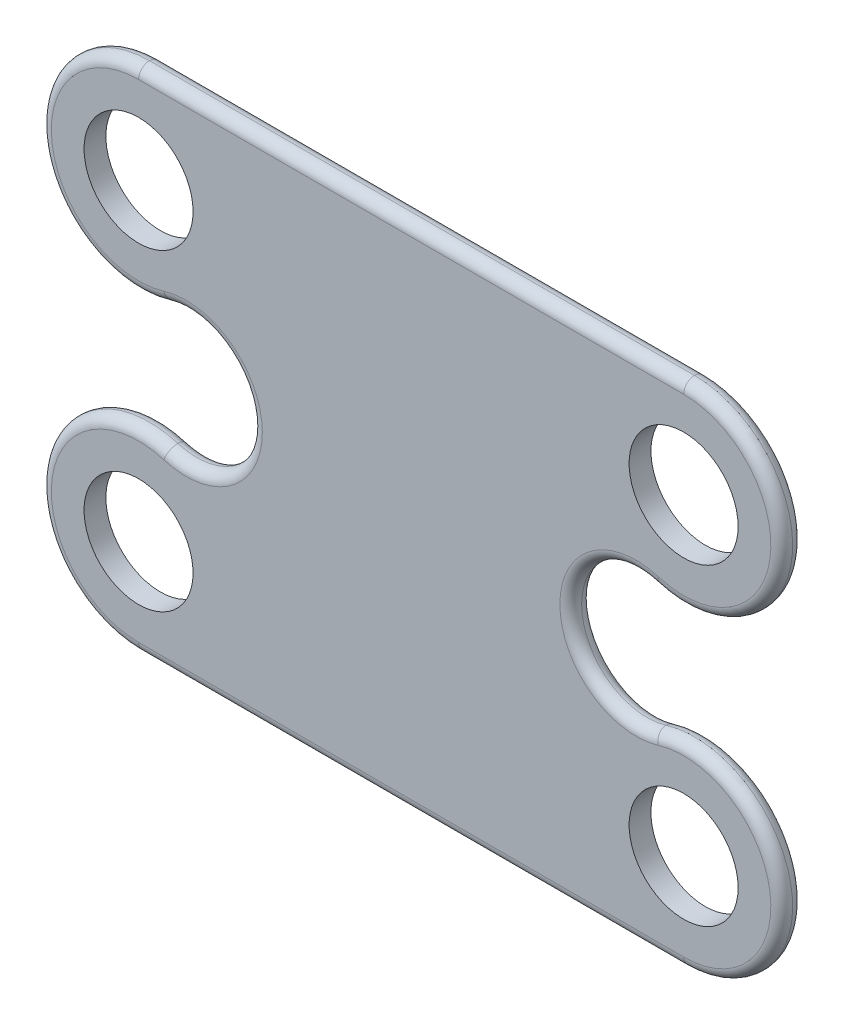
ISO-10303-21;
HEADER;
FILE_DESCRIPTION(('STEP AP214'),'2;1');
FILE_NAME('part.step','',(''),(''),'','','');
FILE_SCHEMA(('AUTOMOTIVE_DESIGN { 1 0 10303 214 1 1 1 1 }'));
ENDSEC;
DATA;
#1=APPLICATION_CONTEXT('core data for automotive mechanical design processes');
#2=APPLICATION_PROTOCOL_DEFINITION('international standard','automotive_design',2000,#1);
#3=PRODUCT_CONTEXT('',#1,'mechanical');
#4=PRODUCT('Part','Part','',(#3));
#5=PRODUCT_RELATED_PRODUCT_CATEGORY('part','',(#4));
#6=PRODUCT_DEFINITION_FORMATION('','',#4);
#7=PRODUCT_DEFINITION_CONTEXT('part definition',#1,'design');
#8=PRODUCT_DEFINITION('design','',#6,#7);
#9=PRODUCT_DEFINITION_SHAPE('','',#8);
#10=(LENGTH_UNIT() NAMED_UNIT(*) SI_UNIT(.MILLI.,.METRE.));
#11=(NAMED_UNIT(*) PLANE_ANGLE_UNIT() SI_UNIT($,.RADIAN.));
#12=(NAMED_UNIT(*) SI_UNIT($,.STERADIAN.) SOLID_ANGLE_UNIT());
#13=UNCERTAINTY_MEASURE_WITH_UNIT(LENGTH_MEASURE(1.E-05),#10,'distance_accuracy_value','');
#14=(GEOMETRIC_REPRESENTATION_CONTEXT(3) GLOBAL_UNCERTAINTY_ASSIGNED_CONTEXT((#13)) GLOBAL_UNIT_ASSIGNED_CONTEXT((#10,
#11,#12)) REPRESENTATION_CONTEXT('',''));
#15=CARTESIAN_POINT('',(0.,0.,0.));
#16=DIRECTION('',(0.,0.,1.));
#17=DIRECTION('',(1.,0.,0.));
#18=AXIS2_PLACEMENT_3D('',#15,#16,#17);
#19=CARTESIAN_POINT('',(-25.,-14.3541525327841,2.));
#20=DIRECTION('',(0.,0.,-1.));
#21=DIRECTION('',(-1.,0.,0.));
#22=AXIS2_PLACEMENT_3D('',#19,#20,#21);
#23=CYLINDRICAL_SURFACE('',#22,5.);
#24=CARTESIAN_POINT('',(-25.,-14.3541525327841,2.));
#25=DIRECTION('',(0.,0.,1.));
#26=DIRECTION('',(1.,0.,0.));
#27=AXIS2_PLACEMENT_3D('',#24,#25,#26);
#28=CIRCLE('',#27,5.);
#29=CARTESIAN_POINT('',(-20.,-14.3541525327841,2.));
#30=VERTEX_POINT('',#29);
#31=EDGE_CURVE('E224',#30,#30,#28,.T.);
#32=ORIENTED_EDGE('',*,*,#31,.T.);
#33=EDGE_LOOP('',(#32));
#34=FACE_BOUND('',#33,.T.);
#35=CARTESIAN_POINT('',(-25.,-14.3541525327841,0.));
#36=DIRECTION('',(0.,0.,1.));
#37=DIRECTION('',(1.,0.,0.));
#38=AXIS2_PLACEMENT_3D('',#35,#36,#37);
#39=CIRCLE('',#38,5.);
#40=CARTESIAN_POINT('',(-20.,-14.3541525327841,0.));
#41=VERTEX_POINT('',#40);
#42=EDGE_CURVE('E229',#41,#41,#39,.T.);
#43=ORIENTED_EDGE('',*,*,#42,.F.);
#44=EDGE_LOOP('',(#43));
#45=FACE_BOUND('',#44,.T.);
#46=ADVANCED_FACE('F36',(#34,#45),#23,.F.);
#47=CARTESIAN_POINT('',(-25.,14.3541525327841,2.));
#48=DIRECTION('',(0.,0.,-1.));
#49=DIRECTION('',(-1.,0.,0.));
#50=AXIS2_PLACEMENT_3D('',#47,#48,#49);
#51=CYLINDRICAL_SURFACE('',#50,5.);
#52=CARTESIAN_POINT('',(-25.,14.3541525327841,2.));
#53=DIRECTION('',(0.,0.,1.));
#54=DIRECTION('',(1.,0.,0.));
#55=AXIS2_PLACEMENT_3D('',#52,#53,#54);
#56=CIRCLE('',#55,5.);
#57=CARTESIAN_POINT('',(-20.,14.3541525327841,2.));
#58=VERTEX_POINT('',#57);
#59=EDGE_CURVE('E496',#58,#58,#56,.F.);
#60=ORIENTED_EDGE('',*,*,#59,.F.);
#61=EDGE_LOOP('',(#60));
#62=FACE_BOUND('',#61,.T.);
#63=CARTESIAN_POINT('',(-25.,14.3541525327841,0.));
#64=DIRECTION('',(0.,0.,1.));
#65=DIRECTION('',(1.,0.,0.));
#66=AXIS2_PLACEMENT_3D('',#63,#64,#65);
#67=CIRCLE('',#66,5.);
#68=CARTESIAN_POINT('',(-20.,14.3541525327841,0.));
#69=VERTEX_POINT('',#68);
#70=EDGE_CURVE('E221',#69,#69,#67,.F.);
#71=ORIENTED_EDGE('',*,*,#70,.T.);
#72=EDGE_LOOP('',(#71));
#73=FACE_BOUND('',#72,.T.);
#74=ADVANCED_FACE('F300',(#62,#73),#51,.F.);
#75=CARTESIAN_POINT('',(25.,14.3541525327841,2.));
#76=DIRECTION('',(0.,0.,-1.));
#77=DIRECTION('',(-1.,0.,0.));
#78=AXIS2_PLACEMENT_3D('',#75,#76,#77);
#79=CYLINDRICAL_SURFACE('',#78,5.);
#80=CARTESIAN_POINT('',(25.,14.3541525327841,2.));
#81=DIRECTION('',(0.,0.,1.));
#82=DIRECTION('',(1.,0.,0.));
#83=AXIS2_PLACEMENT_3D('',#80,#81,#82);
#84=CIRCLE('',#83,5.);
#85=CARTESIAN_POINT('',(30.,14.3541525327841,2.));
#86=VERTEX_POINT('',#85);
#87=EDGE_CURVE('E492',#86,#86,#84,.T.);
#88=ORIENTED_EDGE('',*,*,#87,.T.);
#89=EDGE_LOOP('',(#88));
#90=FACE_BOUND('',#89,.T.);
#91=CARTESIAN_POINT('',(25.,14.3541525327841,0.));
#92=DIRECTION('',(0.,0.,1.));
#93=DIRECTION('',(1.,0.,0.));
#94=AXIS2_PLACEMENT_3D('',#91,#92,#93);
#95=CIRCLE('',#94,5.);
#96=CARTESIAN_POINT('',(30.,14.3541525327841,0.));
#97=VERTEX_POINT('',#96);
#98=EDGE_CURVE('E216',#97,#97,#95,.T.);
#99=ORIENTED_EDGE('',*,*,#98,.F.);
#100=EDGE_LOOP('',(#99));
#101=FACE_BOUND('',#100,.T.);
#102=ADVANCED_FACE('F306',(#90,#101),#79,.F.);
#103=CARTESIAN_POINT('',(25.,-14.3541525327841,2.));
#104=DIRECTION('',(0.,0.,-1.));
#105=DIRECTION('',(-1.,0.,0.));
#106=AXIS2_PLACEMENT_3D('',#103,#104,#105);
#107=CYLINDRICAL_SURFACE('',#106,5.);
#108=CARTESIAN_POINT('',(25.,-14.3541525327841,2.));
#109=DIRECTION('',(0.,0.,1.));
#110=DIRECTION('',(1.,0.,0.));
#111=AXIS2_PLACEMENT_3D('',#108,#109,#110);
#112=CIRCLE('',#111,5.);
#113=CARTESIAN_POINT('',(30.,-14.3541525327841,2.));
#114=VERTEX_POINT('',#113);
#115=EDGE_CURVE('E232',#114,#114,#112,.F.);
#116=ORIENTED_EDGE('',*,*,#115,.F.);
#117=EDGE_LOOP('',(#116));
#118=FACE_BOUND('',#117,.T.);
#119=CARTESIAN_POINT('',(25.,-14.3541525327841,0.));
#120=DIRECTION('',(0.,0.,1.));
#121=DIRECTION('',(1.,0.,0.));
#122=AXIS2_PLACEMENT_3D('',#119,#120,#121);
#123=CIRCLE('',#122,5.);
#124=CARTESIAN_POINT('',(30.,-14.3541525327841,0.));
#125=VERTEX_POINT('',#124);
#126=EDGE_CURVE('E214',#125,#125,#123,.F.);
#127=ORIENTED_EDGE('',*,*,#126,.T.);
#128=EDGE_LOOP('',(#127));
#129=FACE_BOUND('',#128,.T.);
#130=ADVANCED_FACE('F316',(#118,#129),#107,.F.);
#131=CARTESIAN_POINT('',(0.,0.,2.));
#132=DIRECTION('',(0.,0.,1.));
#133=DIRECTION('',(1.,0.,0.));
#134=AXIS2_PLACEMENT_3D('',#131,#132,#133);
#135=PLANE('',#134);
#136=CARTESIAN_POINT('',(-25.,-14.3541525327841,2.));
#137=DIRECTION('',(0.,0.,1.));
#138=DIRECTION('',(1.,0.,0.));
#139=AXIS2_PLACEMENT_3D('',#136,#137,#138);
#140=CIRCLE('',#139,7.99999999999999);
#141=CARTESIAN_POINT('',(-22.6778060907875,-6.69860451529925,2.));
#142=VERTEX_POINT('',#141);
#143=CARTESIAN_POINT('',(-25.,-22.3541525327841,2.));
#144=VERTEX_POINT('',#143);
#145=EDGE_CURVE('E235',#142,#144,#140,.T.);
#146=ORIENTED_EDGE('',*,*,#145,.T.);
#147=DIRECTION('',(-1.,0.,0.));
#148=VECTOR('',#147,1.);
#149=CARTESIAN_POINT('',(0.,-22.3541525327841,2.));
#150=LINE('',#149,#148);
#151=CARTESIAN_POINT('',(25.,-22.3541525327841,2.));
#152=VERTEX_POINT('',#151);
#153=EDGE_CURVE('E246',#144,#152,#150,.F.);
#154=ORIENTED_EDGE('',*,*,#153,.T.);
#155=CARTESIAN_POINT('',(25.,-14.3541525327841,2.));
#156=DIRECTION('',(0.,0.,1.));
#157=DIRECTION('',(1.,0.,0.));
#158=AXIS2_PLACEMENT_3D('',#155,#156,#157);
#159=CIRCLE('',#158,8.);
#160=CARTESIAN_POINT('',(22.6778060907875,-6.69860451529924,2.));
#161=VERTEX_POINT('',#160);
#162=EDGE_CURVE('E244',#152,#161,#159,.T.);
#163=ORIENTED_EDGE('',*,*,#162,.T.);
#164=CARTESIAN_POINT('',(20.6458864202265,0.,2.));
#165=DIRECTION('',(0.,0.,1.));
#166=DIRECTION('',(1.,0.,0.));
#167=AXIS2_PLACEMENT_3D('',#164,#165,#166);
#168=CIRCLE('',#167,7.);
#169=CARTESIAN_POINT('',(22.6778060907875,6.69860451529925,2.));
#170=VERTEX_POINT('',#169);
#171=EDGE_CURVE('E242',#161,#170,#168,.F.);
#172=ORIENTED_EDGE('',*,*,#171,.T.);
#173=CARTESIAN_POINT('',(25.,14.3541525327841,2.));
#174=DIRECTION('',(0.,0.,1.));
#175=DIRECTION('',(1.,0.,0.));
#176=AXIS2_PLACEMENT_3D('',#173,#174,#175);
#177=CIRCLE('',#176,8.);
#178=CARTESIAN_POINT('',(25.,22.3541525327841,2.));
#179=VERTEX_POINT('',#178);
#180=EDGE_CURVE('E240',#170,#179,#177,.T.);
#181=ORIENTED_EDGE('',*,*,#180,.T.);
#182=DIRECTION('',(-1.,0.,0.));
#183=VECTOR('',#182,1.);
#184=CARTESIAN_POINT('',(-25.,22.3541525327841,2.));
#185=LINE('',#184,#183);
#186=CARTESIAN_POINT('',(-25.,22.3541525327841,2.));
#187=VERTEX_POINT('',#186);
#188=EDGE_CURVE('E238',#179,#187,#185,.T.);
#189=ORIENTED_EDGE('',*,*,#188,.T.);
#190=CARTESIAN_POINT('',(-25.,14.3541525327841,2.));
#191=DIRECTION('',(0.,0.,1.));
#192=DIRECTION('',(1.,0.,0.));
#193=AXIS2_PLACEMENT_3D('',#190,#191,#192);
#194=CIRCLE('',#193,7.99999999999999);
#195=CARTESIAN_POINT('',(-22.6778060907875,6.69860451529924,2.));
#196=VERTEX_POINT('',#195);
#197=EDGE_CURVE('E96',#187,#196,#194,.T.);
#198=ORIENTED_EDGE('',*,*,#197,.T.);
#199=CARTESIAN_POINT('',(-20.6458864202265,0.,2.));
#200=DIRECTION('',(0.,0.,1.));
#201=DIRECTION('',(1.,0.,0.));
#202=AXIS2_PLACEMENT_3D('',#199,#200,#201);
#203=CIRCLE('',#202,7.);
#204=EDGE_CURVE('E233',#196,#142,#203,.F.);
#205=ORIENTED_EDGE('',*,*,#204,.T.);
#206=EDGE_LOOP('',(#146,#154,#163,#172,#181,#189,#198,#205));
#207=FACE_BOUND('',#206,.T.);
#208=ORIENTED_EDGE('',*,*,#115,.T.);
#209=EDGE_LOOP('',(#208));
#210=FACE_BOUND('',#209,.T.);
#211=ORIENTED_EDGE('',*,*,#87,.F.);
#212=EDGE_LOOP('',(#211));
#213=FACE_BOUND('',#212,.T.);
#214=ORIENTED_EDGE('',*,*,#59,.T.);
#215=EDGE_LOOP('',(#214));
#216=FACE_BOUND('',#215,.T.);
#217=ORIENTED_EDGE('',*,*,#31,.F.);
#218=EDGE_LOOP('',(#217));
#219=FACE_BOUND('',#218,.T.);
#220=ADVANCED_FACE('F320',(#207,#210,#213,#216,#219),#135,.T.);
#221=CARTESIAN_POINT('',(0.,0.,0.));
#222=DIRECTION('',(0.,0.,1.));
#223=DIRECTION('',(1.,0.,0.));
#224=AXIS2_PLACEMENT_3D('',#221,#222,#223);
#225=PLANE('',#224);
#226=CARTESIAN_POINT('',(25.,-14.3541525327841,0.));
#227=DIRECTION('',(0.,0.,1.));
#228=DIRECTION('',(1.,0.,0.));
#229=AXIS2_PLACEMENT_3D('',#226,#227,#228);
#230=CIRCLE('',#229,8.);
#231=CARTESIAN_POINT('',(22.6778060907875,-6.69860451529924,0.));
#232=VERTEX_POINT('',#231);
#233=CARTESIAN_POINT('',(25.,-22.3541525327841,0.));
#234=VERTEX_POINT('',#233);
#235=EDGE_CURVE('E46',#232,#234,#230,.F.);
#236=ORIENTED_EDGE('',*,*,#235,.T.);
#237=DIRECTION('',(-1.,0.,0.));
#238=VECTOR('',#237,1.);
#239=CARTESIAN_POINT('',(-25.,-22.3541525327841,0.));
#240=LINE('',#239,#238);
#241=CARTESIAN_POINT('',(-25.,-22.3541525327841,0.));
#242=VERTEX_POINT('',#241);
#243=EDGE_CURVE('E11',#234,#242,#240,.T.);
#244=ORIENTED_EDGE('',*,*,#243,.T.);
#245=CARTESIAN_POINT('',(-25.,-14.3541525327841,0.));
#246=DIRECTION('',(0.,0.,1.));
#247=DIRECTION('',(1.,0.,0.));
#248=AXIS2_PLACEMENT_3D('',#245,#246,#247);
#249=CIRCLE('',#248,7.99999999999999);
#250=CARTESIAN_POINT('',(-22.6778060907875,-6.69860451529925,0.));
#251=VERTEX_POINT('',#250);
#252=EDGE_CURVE('E251',#242,#251,#249,.F.);
#253=ORIENTED_EDGE('',*,*,#252,.T.);
#254=CARTESIAN_POINT('',(-20.6458864202265,0.,0.));
#255=DIRECTION('',(0.,0.,1.));
#256=DIRECTION('',(1.,0.,0.));
#257=AXIS2_PLACEMENT_3D('',#254,#255,#256);
#258=CIRCLE('',#257,7.);
#259=CARTESIAN_POINT('',(-22.6778060907875,6.69860451529924,0.));
#260=VERTEX_POINT('',#259);
#261=EDGE_CURVE('E249',#251,#260,#258,.T.);
#262=ORIENTED_EDGE('',*,*,#261,.T.);
#263=CARTESIAN_POINT('',(-25.,14.3541525327841,0.));
#264=DIRECTION('',(0.,0.,1.));
#265=DIRECTION('',(1.,0.,0.));
#266=AXIS2_PLACEMENT_3D('',#263,#264,#265);
#267=CIRCLE('',#266,7.99999999999999);
#268=CARTESIAN_POINT('',(-25.,22.3541525327841,0.));
#269=VERTEX_POINT('',#268);
#270=EDGE_CURVE('E253',#260,#269,#267,.F.);
#271=ORIENTED_EDGE('',*,*,#270,.T.);
#272=DIRECTION('',(-1.,0.,0.));
#273=VECTOR('',#272,1.);
#274=CARTESIAN_POINT('',(0.,22.3541525327841,0.));
#275=LINE('',#274,#273);
#276=CARTESIAN_POINT('',(25.,22.3541525327841,0.));
#277=VERTEX_POINT('',#276);
#278=EDGE_CURVE('E139',#269,#277,#275,.F.);
#279=ORIENTED_EDGE('',*,*,#278,.T.);
#280=CARTESIAN_POINT('',(25.,14.3541525327841,0.));
#281=DIRECTION('',(0.,0.,1.));
#282=DIRECTION('',(1.,0.,0.));
#283=AXIS2_PLACEMENT_3D('',#280,#281,#282);
#284=CIRCLE('',#283,8.);
#285=CARTESIAN_POINT('',(22.6778060907875,6.69860451529925,0.));
#286=VERTEX_POINT('',#285);
#287=EDGE_CURVE('E132',#277,#286,#284,.F.);
#288=ORIENTED_EDGE('',*,*,#287,.T.);
#289=CARTESIAN_POINT('',(20.6458864202265,0.,0.));
#290=DIRECTION('',(0.,0.,1.));
#291=DIRECTION('',(1.,0.,0.));
#292=AXIS2_PLACEMENT_3D('',#289,#290,#291);
#293=CIRCLE('',#292,7.);
#294=EDGE_CURVE('E137',#286,#232,#293,.T.);
#295=ORIENTED_EDGE('',*,*,#294,.T.);
#296=EDGE_LOOP('',(#236,#244,#253,#262,#271,#279,#288,#295));
#297=FACE_BOUND('',#296,.T.);
#298=ORIENTED_EDGE('',*,*,#126,.F.);
#299=EDGE_LOOP('',(#298));
#300=FACE_BOUND('',#299,.T.);
#301=ORIENTED_EDGE('',*,*,#98,.T.);
#302=EDGE_LOOP('',(#301));
#303=FACE_BOUND('',#302,.T.);
#304=ORIENTED_EDGE('',*,*,#70,.F.);
#305=EDGE_LOOP('',(#304));
#306=FACE_BOUND('',#305,.T.);
#307=ORIENTED_EDGE('',*,*,#42,.T.);
#308=EDGE_LOOP('',(#307));
#309=FACE_BOUND('',#308,.T.);
#310=ADVANCED_FACE('F134',(#297,#300,#303,#306,#309),#225,.F.);
#311=CARTESIAN_POINT('',(0.,22.3541525327841,1.));
#312=DIRECTION('',(-1.,0.,0.));
#313=DIRECTION('',(0.,-1.,0.));
#314=AXIS2_PLACEMENT_3D('',#311,#312,#313);
#315=CYLINDRICAL_SURFACE('',#314,1.);
#316=CARTESIAN_POINT('',(25.,22.3541525327841,1.));
#317=DIRECTION('',(1.,0.,0.));
#318=DIRECTION('',(0.,0.,-1.));
#319=AXIS2_PLACEMENT_3D('',#316,#317,#318);
#320=CIRCLE('',#319,1.);
#321=CARTESIAN_POINT('',(25.,23.3541525327841,1.));
#322=VERTEX_POINT('',#321);
#323=EDGE_CURVE('E40',#277,#322,#320,.T.);
#324=ORIENTED_EDGE('',*,*,#323,.F.);
#325=ORIENTED_EDGE('',*,*,#278,.F.);
#326=CARTESIAN_POINT('',(-25.,22.3541525327841,1.));
#327=DIRECTION('',(-1.,0.,0.));
#328=DIRECTION('',(0.,0.,1.));
#329=AXIS2_PLACEMENT_3D('',#326,#327,#328);
#330=CIRCLE('',#329,1.);
#331=CARTESIAN_POINT('',(-25.,23.3541525327841,1.));
#332=VERTEX_POINT('',#331);
#333=EDGE_CURVE('E82',#332,#269,#330,.T.);
#334=ORIENTED_EDGE('',*,*,#333,.F.);
#335=DIRECTION('',(-1.,0.,0.));
#336=VECTOR('',#335,1.);
#337=CARTESIAN_POINT('',(0.,23.3541525327841,1.));
#338=LINE('',#337,#336);
#339=EDGE_CURVE('E210',#322,#332,#338,.T.);
#340=ORIENTED_EDGE('',*,*,#339,.F.);
#341=EDGE_LOOP('',(#324,#325,#334,#340));
#342=FACE_BOUND('',#341,.T.);
#343=ADVANCED_FACE('F38',(#342),#315,.T.);
#344=CARTESIAN_POINT('',(25.,14.3541525327841,1.));
#345=DIRECTION('',(0.,0.,1.));
#346=DIRECTION('',(1.,0.,0.));
#347=AXIS2_PLACEMENT_3D('',#344,#345,#346);
#348=TOROIDAL_SURFACE('',#347,8.,1.);
#349=ORIENTED_EDGE('',*,*,#287,.F.);
#350=ORIENTED_EDGE('',*,*,#323,.T.);
#351=CARTESIAN_POINT('',(25.,14.3541525327841,1.));
#352=DIRECTION('',(0.,0.,1.));
#353=DIRECTION('',(1.,0.,0.));
#354=AXIS2_PLACEMENT_3D('',#351,#352,#353);
#355=CIRCLE('',#354,9.);
#356=CARTESIAN_POINT('',(22.3875318521359,5.74166101311364,1.));
#357=VERTEX_POINT('',#356);
#358=EDGE_CURVE('E145',#357,#322,#355,.T.);
#359=ORIENTED_EDGE('',*,*,#358,.F.);
#360=CARTESIAN_POINT('',(22.6778060907875,6.69860451529925,1.));
#361=DIRECTION('',(-0.956943502185606,0.290274238651567,0.));
#362=DIRECTION('',(-0.290274238651567,-0.956943502185606,0.));
#363=AXIS2_PLACEMENT_3D('',#360,#361,#362);
#364=CIRCLE('',#363,1.);
#365=EDGE_CURVE('E142',#286,#357,#364,.T.);
#366=ORIENTED_EDGE('',*,*,#365,.F.);
#367=EDGE_LOOP('',(#349,#350,#359,#366));
#368=FACE_BOUND('',#367,.T.);
#369=ADVANCED_FACE('F143',(#368),#348,.T.);
#370=CARTESIAN_POINT('',(-25.,14.3541525327841,1.));
#371=DIRECTION('',(0.,0.,1.));
#372=DIRECTION('',(1.,0.,0.));
#373=AXIS2_PLACEMENT_3D('',#370,#371,#372);
#374=TOROIDAL_SURFACE('',#373,7.99999999999999,1.);
#375=ORIENTED_EDGE('',*,*,#333,.T.);
#376=ORIENTED_EDGE('',*,*,#270,.F.);
#377=CARTESIAN_POINT('',(-22.6778060907875,6.69860451529925,1.));
#378=DIRECTION('',(0.956943502185606,0.290274238651567,0.));
#379=DIRECTION('',(-0.290274238651567,0.956943502185606,0.));
#380=AXIS2_PLACEMENT_3D('',#377,#378,#379);
#381=CIRCLE('',#380,1.);
#382=CARTESIAN_POINT('',(-22.3875318521359,5.74166101311364,1.));
#383=VERTEX_POINT('',#382);
#384=EDGE_CURVE('E148',#383,#260,#381,.T.);
#385=ORIENTED_EDGE('',*,*,#384,.F.);
#386=CARTESIAN_POINT('',(-25.,14.3541525327841,1.));
#387=DIRECTION('',(0.,0.,1.));
#388=DIRECTION('',(1.,0.,0.));
#389=AXIS2_PLACEMENT_3D('',#386,#387,#388);
#390=CIRCLE('',#389,8.99999999999999);
#391=EDGE_CURVE('E201',#332,#383,#390,.T.);
#392=ORIENTED_EDGE('',*,*,#391,.F.);
#393=EDGE_LOOP('',(#375,#376,#385,#392));
#394=FACE_BOUND('',#393,.T.);
#395=ADVANCED_FACE('F291',(#394),#374,.T.);
#396=CARTESIAN_POINT('',(0.,22.3541525327841,1.));
#397=DIRECTION('',(1.,0.,0.));
#398=DIRECTION('',(0.,1.,0.));
#399=AXIS2_PLACEMENT_3D('',#396,#397,#398);
#400=CYLINDRICAL_SURFACE('',#399,1.);
#401=CARTESIAN_POINT('',(-25.,22.3541525327841,1.));
#402=DIRECTION('',(-1.,0.,0.));
#403=DIRECTION('',(0.,0.,1.));
#404=AXIS2_PLACEMENT_3D('',#401,#402,#403);
#405=CIRCLE('',#404,1.);
#406=EDGE_CURVE('E198',#187,#332,#405,.T.);
#407=ORIENTED_EDGE('',*,*,#406,.F.);
#408=ORIENTED_EDGE('',*,*,#188,.F.);
#409=CARTESIAN_POINT('',(25.,22.3541525327841,1.));
#410=DIRECTION('',(1.,0.,0.));
#411=DIRECTION('',(0.,0.,-1.));
#412=AXIS2_PLACEMENT_3D('',#409,#410,#411);
#413=CIRCLE('',#412,1.);
#414=EDGE_CURVE('E207',#322,#179,#413,.T.);
#415=ORIENTED_EDGE('',*,*,#414,.F.);
#416=ORIENTED_EDGE('',*,*,#339,.T.);
#417=EDGE_LOOP('',(#407,#408,#415,#416));
#418=FACE_BOUND('',#417,.T.);
#419=ADVANCED_FACE('F259',(#418),#400,.T.);
#420=CARTESIAN_POINT('',(25.,14.3541525327841,1.));
#421=DIRECTION('',(0.,0.,1.));
#422=DIRECTION('',(1.,0.,0.));
#423=AXIS2_PLACEMENT_3D('',#420,#421,#422);
#424=TOROIDAL_SURFACE('',#423,8.,1.);
#425=ORIENTED_EDGE('',*,*,#414,.T.);
#426=ORIENTED_EDGE('',*,*,#180,.F.);
#427=CARTESIAN_POINT('',(22.6778060907875,6.69860451529924,1.));
#428=DIRECTION('',(-0.956943502185606,0.290274238651567,0.));
#429=DIRECTION('',(-0.290274238651567,-0.956943502185606,0.));
#430=AXIS2_PLACEMENT_3D('',#427,#428,#429);
#431=CIRCLE('',#430,1.);
#432=EDGE_CURVE('E195',#357,#170,#431,.T.);
#433=ORIENTED_EDGE('',*,*,#432,.F.);
#434=ORIENTED_EDGE('',*,*,#358,.T.);
#435=EDGE_LOOP('',(#425,#426,#433,#434));
#436=FACE_BOUND('',#435,.T.);
#437=ADVANCED_FACE('F262',(#436),#424,.T.);
#438=CARTESIAN_POINT('',(20.6458864202265,0.,1.));
#439=DIRECTION('',(0.,0.,1.));
#440=DIRECTION('',(1.,0.,0.));
#441=AXIS2_PLACEMENT_3D('',#438,#439,#440);
#442=TOROIDAL_SURFACE('',#441,7.,1.);
#443=ORIENTED_EDGE('',*,*,#294,.F.);
#444=ORIENTED_EDGE('',*,*,#365,.T.);
#445=CARTESIAN_POINT('',(20.6458864202265,0.,1.));
#446=DIRECTION('',(0.,0.,1.));
#447=DIRECTION('',(1.,0.,0.));
#448=AXIS2_PLACEMENT_3D('',#445,#446,#447);
#449=CIRCLE('',#448,6.);
#450=CARTESIAN_POINT('',(22.3875318521359,-5.74166101311363,1.));
#451=VERTEX_POINT('',#450);
#452=EDGE_CURVE('E192',#451,#357,#449,.F.);
#453=ORIENTED_EDGE('',*,*,#452,.F.);
#454=CARTESIAN_POINT('',(22.6778060907875,-6.69860451529924,1.));
#455=DIRECTION('',(0.956943502185606,0.290274238651567,0.));
#456=DIRECTION('',(-0.290274238651567,0.956943502185606,0.));
#457=AXIS2_PLACEMENT_3D('',#454,#455,#456);
#458=CIRCLE('',#457,1.);
#459=EDGE_CURVE('E152',#232,#451,#458,.T.);
#460=ORIENTED_EDGE('',*,*,#459,.F.);
#461=EDGE_LOOP('',(#443,#444,#453,#460));
#462=FACE_BOUND('',#461,.T.);
#463=ADVANCED_FACE('F150',(#462),#442,.T.);
#464=CARTESIAN_POINT('',(-20.6458864202265,0.,1.));
#465=DIRECTION('',(0.,0.,1.));
#466=DIRECTION('',(1.,0.,0.));
#467=AXIS2_PLACEMENT_3D('',#464,#465,#466);
#468=TOROIDAL_SURFACE('',#467,7.,1.);
#469=ORIENTED_EDGE('',*,*,#384,.T.);
#470=ORIENTED_EDGE('',*,*,#261,.F.);
#471=CARTESIAN_POINT('',(-22.6778060907875,-6.69860451529924,1.));
#472=DIRECTION('',(-0.956943502185606,0.290274238651567,0.));
#473=DIRECTION('',(-0.290274238651567,-0.956943502185606,0.));
#474=AXIS2_PLACEMENT_3D('',#471,#472,#473);
#475=CIRCLE('',#474,1.);
#476=CARTESIAN_POINT('',(-22.3875318521359,-5.74166101311364,1.));
#477=VERTEX_POINT('',#476);
#478=EDGE_CURVE('E188',#477,#251,#475,.T.);
#479=ORIENTED_EDGE('',*,*,#478,.F.);
#480=CARTESIAN_POINT('',(-20.6458864202265,0.,1.));
#481=DIRECTION('',(0.,0.,1.));
#482=DIRECTION('',(1.,0.,0.));
#483=AXIS2_PLACEMENT_3D('',#480,#481,#482);
#484=CIRCLE('',#483,6.);
#485=EDGE_CURVE('E185',#383,#477,#484,.F.);
#486=ORIENTED_EDGE('',*,*,#485,.F.);
#487=EDGE_LOOP('',(#469,#470,#479,#486));
#488=FACE_BOUND('',#487,.T.);
#489=ADVANCED_FACE('F277',(#488),#468,.T.);
#490=CARTESIAN_POINT('',(-25.,14.3541525327841,1.));
#491=DIRECTION('',(0.,0.,1.));
#492=DIRECTION('',(1.,0.,0.));
#493=AXIS2_PLACEMENT_3D('',#490,#491,#492);
#494=TOROIDAL_SURFACE('',#493,7.99999999999999,1.);
#495=ORIENTED_EDGE('',*,*,#406,.T.);
#496=ORIENTED_EDGE('',*,*,#391,.T.);
#497=CARTESIAN_POINT('',(-22.6778060907875,6.69860451529925,1.));
#498=DIRECTION('',(0.956943502185606,0.290274238651568,0.));
#499=DIRECTION('',(-0.290274238651568,0.956943502185606,0.));
#500=AXIS2_PLACEMENT_3D('',#497,#498,#499);
#501=CIRCLE('',#500,1.);
#502=EDGE_CURVE('E182',#196,#383,#501,.T.);
#503=ORIENTED_EDGE('',*,*,#502,.F.);
#504=ORIENTED_EDGE('',*,*,#197,.F.);
#505=EDGE_LOOP('',(#495,#496,#503,#504));
#506=FACE_BOUND('',#505,.T.);
#507=ADVANCED_FACE('F290',(#506),#494,.T.);
#508=CARTESIAN_POINT('',(20.6458864202265,0.,1.));
#509=DIRECTION('',(0.,0.,1.));
#510=DIRECTION('',(1.,0.,0.));
#511=AXIS2_PLACEMENT_3D('',#508,#509,#510);
#512=TOROIDAL_SURFACE('',#511,7.,1.);
#513=ORIENTED_EDGE('',*,*,#432,.T.);
#514=ORIENTED_EDGE('',*,*,#171,.F.);
#515=CARTESIAN_POINT('',(22.6778060907875,-6.69860451529924,1.));
#516=DIRECTION('',(0.956943502185606,0.290274238651567,0.));
#517=DIRECTION('',(-0.290274238651567,0.956943502185606,0.));
#518=AXIS2_PLACEMENT_3D('',#515,#516,#517);
#519=CIRCLE('',#518,1.);
#520=EDGE_CURVE('E179',#451,#161,#519,.T.);
#521=ORIENTED_EDGE('',*,*,#520,.F.);
#522=ORIENTED_EDGE('',*,*,#452,.T.);
#523=EDGE_LOOP('',(#513,#514,#521,#522));
#524=FACE_BOUND('',#523,.T.);
#525=ADVANCED_FACE('F266',(#524),#512,.T.);
#526=CARTESIAN_POINT('',(25.,-14.3541525327841,1.));
#527=DIRECTION('',(0.,0.,1.));
#528=DIRECTION('',(1.,0.,0.));
#529=AXIS2_PLACEMENT_3D('',#526,#527,#528);
#530=TOROIDAL_SURFACE('',#529,8.,1.);
#531=ORIENTED_EDGE('',*,*,#235,.F.);
#532=ORIENTED_EDGE('',*,*,#459,.T.);
#533=CARTESIAN_POINT('',(25.,-14.3541525327841,1.));
#534=DIRECTION('',(0.,0.,1.));
#535=DIRECTION('',(1.,0.,0.));
#536=AXIS2_PLACEMENT_3D('',#533,#534,#535);
#537=CIRCLE('',#536,9.);
#538=CARTESIAN_POINT('',(25.,-23.3541525327841,1.));
#539=VERTEX_POINT('',#538);
#540=EDGE_CURVE('E176',#539,#451,#537,.T.);
#541=ORIENTED_EDGE('',*,*,#540,.F.);
#542=CARTESIAN_POINT('',(25.,-22.3541525327841,1.));
#543=DIRECTION('',(-1.,0.,0.));
#544=DIRECTION('',(0.,0.,1.));
#545=AXIS2_PLACEMENT_3D('',#542,#543,#544);
#546=CIRCLE('',#545,1.);
#547=EDGE_CURVE('E173',#234,#539,#546,.T.);
#548=ORIENTED_EDGE('',*,*,#547,.F.);
#549=EDGE_LOOP('',(#531,#532,#541,#548));
#550=FACE_BOUND('',#549,.T.);
#551=ADVANCED_FACE('F268',(#550),#530,.T.);
#552=CARTESIAN_POINT('',(-25.,-14.3541525327841,1.));
#553=DIRECTION('',(0.,0.,1.));
#554=DIRECTION('',(1.,0.,0.));
#555=AXIS2_PLACEMENT_3D('',#552,#553,#554);
#556=TOROIDAL_SURFACE('',#555,7.99999999999999,1.);
#557=ORIENTED_EDGE('',*,*,#478,.T.);
#558=ORIENTED_EDGE('',*,*,#252,.F.);
#559=CARTESIAN_POINT('',(-25.,-22.3541525327841,1.));
#560=DIRECTION('',(1.,0.,0.));
#561=DIRECTION('',(0.,0.,-1.));
#562=AXIS2_PLACEMENT_3D('',#559,#560,#561);
#563=CIRCLE('',#562,1.);
#564=CARTESIAN_POINT('',(-25.,-23.3541525327841,1.));
#565=VERTEX_POINT('',#564);
#566=EDGE_CURVE('E171',#565,#242,#563,.T.);
#567=ORIENTED_EDGE('',*,*,#566,.F.);
#568=CARTESIAN_POINT('',(-25.,-14.3541525327841,1.));
#569=DIRECTION('',(0.,0.,1.));
#570=DIRECTION('',(1.,0.,0.));
#571=AXIS2_PLACEMENT_3D('',#568,#569,#570);
#572=CIRCLE('',#571,8.99999999999999);
#573=EDGE_CURVE('E168',#477,#565,#572,.T.);
#574=ORIENTED_EDGE('',*,*,#573,.F.);
#575=EDGE_LOOP('',(#557,#558,#567,#574));
#576=FACE_BOUND('',#575,.T.);
#577=ADVANCED_FACE('F280',(#576),#556,.T.);
#578=CARTESIAN_POINT('',(-20.6458864202265,0.,1.));
#579=DIRECTION('',(0.,0.,1.));
#580=DIRECTION('',(1.,0.,0.));
#581=AXIS2_PLACEMENT_3D('',#578,#579,#580);
#582=TOROIDAL_SURFACE('',#581,7.,1.);
#583=ORIENTED_EDGE('',*,*,#502,.T.);
#584=ORIENTED_EDGE('',*,*,#485,.T.);
#585=CARTESIAN_POINT('',(-22.6778060907875,-6.69860451529925,1.));
#586=DIRECTION('',(-0.956943502185606,0.290274238651567,0.));
#587=DIRECTION('',(-0.290274238651567,-0.956943502185606,0.));
#588=AXIS2_PLACEMENT_3D('',#585,#586,#587);
#589=CIRCLE('',#588,1.);
#590=EDGE_CURVE('E165',#142,#477,#589,.T.);
#591=ORIENTED_EDGE('',*,*,#590,.F.);
#592=ORIENTED_EDGE('',*,*,#204,.F.);
#593=EDGE_LOOP('',(#583,#584,#591,#592));
#594=FACE_BOUND('',#593,.T.);
#595=ADVANCED_FACE('F288',(#594),#582,.T.);
#596=CARTESIAN_POINT('',(25.,-14.3541525327841,1.));
#597=DIRECTION('',(0.,0.,1.));
#598=DIRECTION('',(1.,0.,0.));
#599=AXIS2_PLACEMENT_3D('',#596,#597,#598);
#600=TOROIDAL_SURFACE('',#599,8.,1.);
#601=ORIENTED_EDGE('',*,*,#520,.T.);
#602=ORIENTED_EDGE('',*,*,#162,.F.);
#603=CARTESIAN_POINT('',(25.,-22.3541525327841,1.));
#604=DIRECTION('',(-1.,0.,0.));
#605=DIRECTION('',(0.,0.,1.));
#606=AXIS2_PLACEMENT_3D('',#603,#604,#605);
#607=CIRCLE('',#606,1.);
#608=EDGE_CURVE('E163',#539,#152,#607,.T.);
#609=ORIENTED_EDGE('',*,*,#608,.F.);
#610=ORIENTED_EDGE('',*,*,#540,.T.);
#611=EDGE_LOOP('',(#601,#602,#609,#610));
#612=FACE_BOUND('',#611,.T.);
#613=ADVANCED_FACE('F330',(#612),#600,.T.);
#614=CARTESIAN_POINT('',(0.,-22.3541525327841,1.));
#615=DIRECTION('',(1.,0.,0.));
#616=DIRECTION('',(0.,1.,0.));
#617=AXIS2_PLACEMENT_3D('',#614,#615,#616);
#618=CYLINDRICAL_SURFACE('',#617,1.);
#619=ORIENTED_EDGE('',*,*,#243,.F.);
#620=ORIENTED_EDGE('',*,*,#547,.T.);
#621=DIRECTION('',(-1.,0.,0.));
#622=VECTOR('',#621,1.);
#623=CARTESIAN_POINT('',(25.,-23.3541525327841,1.));
#624=LINE('',#623,#622);
#625=EDGE_CURVE('E160',#565,#539,#624,.F.);
#626=ORIENTED_EDGE('',*,*,#625,.F.);
#627=ORIENTED_EDGE('',*,*,#566,.T.);
#628=EDGE_LOOP('',(#619,#620,#626,#627));
#629=FACE_BOUND('',#628,.T.);
#630=ADVANCED_FACE('F273',(#629),#618,.T.);
#631=CARTESIAN_POINT('',(-25.,-14.3541525327841,1.));
#632=DIRECTION('',(0.,0.,1.));
#633=DIRECTION('',(1.,0.,0.));
#634=AXIS2_PLACEMENT_3D('',#631,#632,#633);
#635=TOROIDAL_SURFACE('',#634,7.99999999999999,1.);
#636=ORIENTED_EDGE('',*,*,#590,.T.);
#637=ORIENTED_EDGE('',*,*,#573,.T.);
#638=CARTESIAN_POINT('',(-25.,-22.3541525327841,1.));
#639=DIRECTION('',(1.,0.,0.));
#640=DIRECTION('',(0.,0.,-1.));
#641=AXIS2_PLACEMENT_3D('',#638,#639,#640);
#642=CIRCLE('',#641,1.);
#643=EDGE_CURVE('E157',#144,#565,#642,.T.);
#644=ORIENTED_EDGE('',*,*,#643,.F.);
#645=ORIENTED_EDGE('',*,*,#145,.F.);
#646=EDGE_LOOP('',(#636,#637,#644,#645));
#647=FACE_BOUND('',#646,.T.);
#648=ADVANCED_FACE('F285',(#647),#635,.T.);
#649=CARTESIAN_POINT('',(0.,-22.3541525327841,1.));
#650=DIRECTION('',(-1.,0.,0.));
#651=DIRECTION('',(0.,-1.,0.));
#652=AXIS2_PLACEMENT_3D('',#649,#650,#651);
#653=CYLINDRICAL_SURFACE('',#652,1.);
#654=ORIENTED_EDGE('',*,*,#608,.T.);
#655=ORIENTED_EDGE('',*,*,#153,.F.);
#656=ORIENTED_EDGE('',*,*,#643,.T.);
#657=ORIENTED_EDGE('',*,*,#625,.T.);
#658=EDGE_LOOP('',(#654,#655,#656,#657));
#659=FACE_BOUND('',#658,.T.);
#660=ADVANCED_FACE('F322',(#659),#653,.T.);
#661=CLOSED_SHELL('',(#46,#74,#102,#130,#220,#310,#343,#369,#395,#419,#437,#463,#489,#507,#525,
#551,#577,#595,#613,#630,#648,#660));
#662=MANIFOLD_SOLID_BREP('B2',#661);
#663=ADVANCED_BREP_SHAPE_REPRESENTATION('',(#18,#662),#14);
#664=SHAPE_DEFINITION_REPRESENTATION(#9,#663);
ENDSEC;
END-ISO-10303-21;
